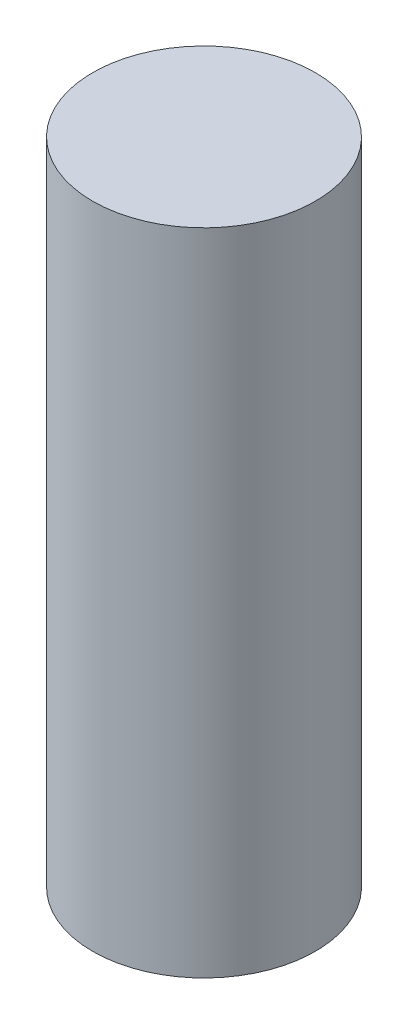
ISO-10303-21;
HEADER;
FILE_DESCRIPTION(('STEP AP214'),'2;1');
FILE_NAME('part.step','',(''),(''),'','','');
FILE_SCHEMA(('AUTOMOTIVE_DESIGN { 1 0 10303 214 1 1 1 1 }'));
ENDSEC;
DATA;
#1=APPLICATION_CONTEXT('core data for automotive mechanical design processes');
#2=APPLICATION_PROTOCOL_DEFINITION('international standard','automotive_design',2000,#1);
#3=PRODUCT_CONTEXT('',#1,'mechanical');
#4=PRODUCT('Part','Part','',(#3));
#5=PRODUCT_RELATED_PRODUCT_CATEGORY('part','',(#4));
#6=PRODUCT_DEFINITION_FORMATION('','',#4);
#7=PRODUCT_DEFINITION_CONTEXT('part definition',#1,'design');
#8=PRODUCT_DEFINITION('design','',#6,#7);
#9=PRODUCT_DEFINITION_SHAPE('','',#8);
#10=(LENGTH_UNIT() NAMED_UNIT(*) SI_UNIT(.MILLI.,.METRE.));
#11=(NAMED_UNIT(*) PLANE_ANGLE_UNIT() SI_UNIT($,.RADIAN.));
#12=(NAMED_UNIT(*) SI_UNIT($,.STERADIAN.) SOLID_ANGLE_UNIT());
#13=UNCERTAINTY_MEASURE_WITH_UNIT(LENGTH_MEASURE(1.E-05),#10,'distance_accuracy_value','');
#14=(GEOMETRIC_REPRESENTATION_CONTEXT(3) GLOBAL_UNCERTAINTY_ASSIGNED_CONTEXT((#13)) GLOBAL_UNIT_ASSIGNED_CONTEXT((#10,
#11,#12)) REPRESENTATION_CONTEXT('',''));
#15=CARTESIAN_POINT('',(0.,0.,0.));
#16=DIRECTION('',(0.,0.,1.));
#17=DIRECTION('',(1.,0.,0.));
#18=AXIS2_PLACEMENT_3D('',#15,#16,#17);
#19=CARTESIAN_POINT('',(0.,889.,0.));
#20=DIRECTION('',(0.,-1.,0.));
#21=DIRECTION('',(0.,0.,-1.));
#22=AXIS2_PLACEMENT_3D('',#19,#20,#21);
#23=CYLINDRICAL_SURFACE('',#22,152.4);
#24=CARTESIAN_POINT('',(0.,889.,0.));
#25=DIRECTION('',(0.,1.,0.));
#26=DIRECTION('',(0.,0.,1.));
#27=AXIS2_PLACEMENT_3D('',#24,#25,#26);
#28=CIRCLE('',#27,152.4);
#29=CARTESIAN_POINT('',(0.,889.,152.4));
#30=VERTEX_POINT('',#29);
#31=EDGE_CURVE('E10',#30,#30,#28,.T.);
#32=ORIENTED_EDGE('',*,*,#31,.F.);
#33=EDGE_LOOP('',(#32));
#34=FACE_BOUND('',#33,.T.);
#35=CARTESIAN_POINT('',(0.,0.,0.));
#36=DIRECTION('',(0.,1.,0.));
#37=DIRECTION('',(0.,0.,1.));
#38=AXIS2_PLACEMENT_3D('',#35,#36,#37);
#39=CIRCLE('',#38,152.4);
#40=CARTESIAN_POINT('',(0.,0.,152.4));
#41=VERTEX_POINT('',#40);
#42=EDGE_CURVE('E37',#41,#41,#39,.T.);
#43=ORIENTED_EDGE('',*,*,#42,.T.);
#44=EDGE_LOOP('',(#43));
#45=FACE_BOUND('',#44,.T.);
#46=ADVANCED_FACE('F40',(#34,#45),#23,.T.);
#47=CARTESIAN_POINT('',(0.,889.,0.));
#48=DIRECTION('',(0.,1.,0.));
#49=DIRECTION('',(0.,0.,1.));
#50=AXIS2_PLACEMENT_3D('',#47,#48,#49);
#51=PLANE('',#50);
#52=ORIENTED_EDGE('',*,*,#31,.T.);
#53=EDGE_LOOP('',(#52));
#54=FACE_BOUND('',#53,.T.);
#55=ADVANCED_FACE('F55',(#54),#51,.T.);
#56=CARTESIAN_POINT('',(0.,0.,0.));
#57=DIRECTION('',(0.,1.,0.));
#58=DIRECTION('',(0.,0.,1.));
#59=AXIS2_PLACEMENT_3D('',#56,#57,#58);
#60=PLANE('',#59);
#61=ORIENTED_EDGE('',*,*,#42,.F.);
#62=EDGE_LOOP('',(#61));
#63=FACE_BOUND('',#62,.T.);
#64=ADVANCED_FACE('F49',(#63),#60,.F.);
#65=CLOSED_SHELL('',(#46,#55,#64));
#66=MANIFOLD_SOLID_BREP('B2',#65);
#67=ADVANCED_BREP_SHAPE_REPRESENTATION('',(#18,#66),#14);
#68=SHAPE_DEFINITION_REPRESENTATION(#9,#67);
ENDSEC;
END-ISO-10303-21;
